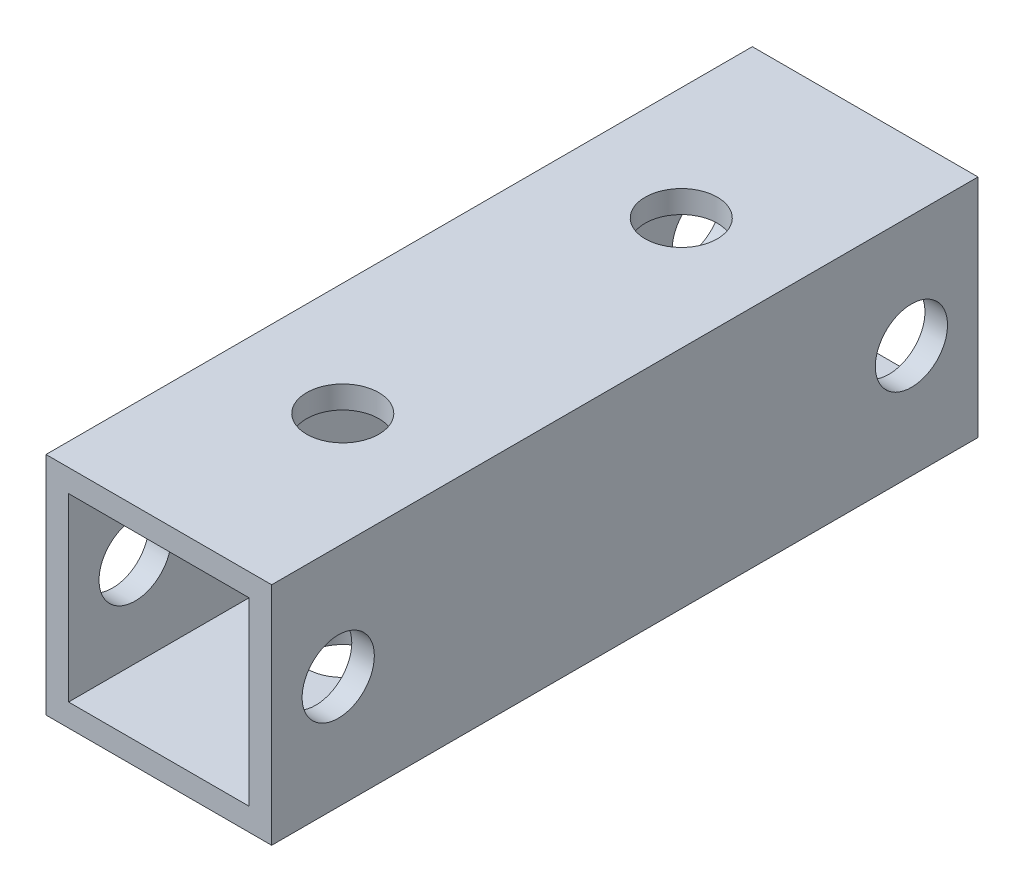
ISO-10303-21;
HEADER;
FILE_DESCRIPTION(('STEP AP214'),'2;1');
FILE_NAME('part.step','',(''),(''),'','','');
FILE_SCHEMA(('AUTOMOTIVE_DESIGN { 1 0 10303 214 1 1 1 1 }'));
ENDSEC;
DATA;
#1=APPLICATION_CONTEXT('core data for automotive mechanical design processes');
#2=APPLICATION_PROTOCOL_DEFINITION('international standard','automotive_design',2000,#1);
#3=PRODUCT_CONTEXT('',#1,'mechanical');
#4=PRODUCT('Part','Part','',(#3));
#5=PRODUCT_RELATED_PRODUCT_CATEGORY('part','',(#4));
#6=PRODUCT_DEFINITION_FORMATION('','',#4);
#7=PRODUCT_DEFINITION_CONTEXT('part definition',#1,'design');
#8=PRODUCT_DEFINITION('design','',#6,#7);
#9=PRODUCT_DEFINITION_SHAPE('','',#8);
#10=(LENGTH_UNIT() NAMED_UNIT(*) SI_UNIT(.MILLI.,.METRE.));
#11=(NAMED_UNIT(*) PLANE_ANGLE_UNIT() SI_UNIT($,.RADIAN.));
#12=(NAMED_UNIT(*) SI_UNIT($,.STERADIAN.) SOLID_ANGLE_UNIT());
#13=UNCERTAINTY_MEASURE_WITH_UNIT(LENGTH_MEASURE(1.E-05),#10,'distance_accuracy_value','');
#14=(GEOMETRIC_REPRESENTATION_CONTEXT(3) GLOBAL_UNCERTAINTY_ASSIGNED_CONTEXT((#13)) GLOBAL_UNIT_ASSIGNED_CONTEXT((#10,
#11,#12)) REPRESENTATION_CONTEXT('',''));
#15=CARTESIAN_POINT('',(0.,0.,0.));
#16=DIRECTION('',(0.,0.,1.));
#17=DIRECTION('',(1.,0.,0.));
#18=AXIS2_PLACEMENT_3D('',#15,#16,#17);
#19=CARTESIAN_POINT('',(0.,0.,31.3));
#20=DIRECTION('',(0.,0.,1.));
#21=DIRECTION('',(1.,0.,0.));
#22=AXIS2_PLACEMENT_3D('',#19,#20,#21);
#23=PLANE('',#22);
#24=DIRECTION('',(0.,-1.,0.));
#25=VECTOR('',#24,1.);
#26=CARTESIAN_POINT('',(0.,0.,31.3));
#27=LINE('',#26,#25);
#28=CARTESIAN_POINT('',(0.,10.,31.3));
#29=VERTEX_POINT('',#28);
#30=CARTESIAN_POINT('',(0.,0.,31.3));
#31=VERTEX_POINT('',#30);
#32=EDGE_CURVE('E162',#29,#31,#27,.T.);
#33=ORIENTED_EDGE('',*,*,#32,.T.);
#34=DIRECTION('',(1.,0.,0.));
#35=VECTOR('',#34,1.);
#36=CARTESIAN_POINT('',(0.,0.,31.3));
#37=LINE('',#36,#35);
#38=CARTESIAN_POINT('',(10.,0.,31.3));
#39=VERTEX_POINT('',#38);
#40=EDGE_CURVE('E165',#31,#39,#37,.T.);
#41=ORIENTED_EDGE('',*,*,#40,.T.);
#42=DIRECTION('',(0.,1.,0.));
#43=VECTOR('',#42,1.);
#44=CARTESIAN_POINT('',(10.,0.,31.3));
#45=LINE('',#44,#43);
#46=CARTESIAN_POINT('',(10.,10.,31.3));
#47=VERTEX_POINT('',#46);
#48=EDGE_CURVE('E168',#39,#47,#45,.T.);
#49=ORIENTED_EDGE('',*,*,#48,.T.);
#50=DIRECTION('',(-1.,0.,0.));
#51=VECTOR('',#50,1.);
#52=CARTESIAN_POINT('',(0.,10.,31.3));
#53=LINE('',#52,#51);
#54=EDGE_CURVE('E170',#47,#29,#53,.T.);
#55=ORIENTED_EDGE('',*,*,#54,.T.);
#56=EDGE_LOOP('',(#33,#41,#49,#55));
#57=FACE_BOUND('',#56,.T.);
#58=DIRECTION('',(1.,0.,0.));
#59=VECTOR('',#58,1.);
#60=CARTESIAN_POINT('',(0.,1.,31.3));
#61=LINE('',#60,#59);
#62=CARTESIAN_POINT('',(1.,1.,31.3));
#63=VERTEX_POINT('',#62);
#64=CARTESIAN_POINT('',(9.,1.,31.3));
#65=VERTEX_POINT('',#64);
#66=EDGE_CURVE('E132',#63,#65,#61,.T.);
#67=ORIENTED_EDGE('',*,*,#66,.F.);
#68=DIRECTION('',(0.,-1.,0.));
#69=VECTOR('',#68,1.);
#70=CARTESIAN_POINT('',(1.,0.,31.3));
#71=LINE('',#70,#69);
#72=CARTESIAN_POINT('',(1.,9.,31.3));
#73=VERTEX_POINT('',#72);
#74=EDGE_CURVE('E124',#73,#63,#71,.T.);
#75=ORIENTED_EDGE('',*,*,#74,.F.);
#76=DIRECTION('',(-1.,0.,0.));
#77=VECTOR('',#76,1.);
#78=CARTESIAN_POINT('',(0.,9.,31.3));
#79=LINE('',#78,#77);
#80=CARTESIAN_POINT('',(9.,9.,31.3));
#81=VERTEX_POINT('',#80);
#82=EDGE_CURVE('E146',#81,#73,#79,.T.);
#83=ORIENTED_EDGE('',*,*,#82,.F.);
#84=DIRECTION('',(0.,1.,0.));
#85=VECTOR('',#84,1.);
#86=CARTESIAN_POINT('',(9.,0.,31.3));
#87=LINE('',#86,#85);
#88=EDGE_CURVE('E144',#65,#81,#87,.T.);
#89=ORIENTED_EDGE('',*,*,#88,.F.);
#90=EDGE_LOOP('',(#67,#75,#83,#89));
#91=FACE_BOUND('',#90,.T.);
#92=ADVANCED_FACE('F57',(#57,#91),#23,.T.);
#93=CARTESIAN_POINT('',(0.,0.,0.));
#94=DIRECTION('',(0.,0.,1.));
#95=DIRECTION('',(1.,0.,0.));
#96=AXIS2_PLACEMENT_3D('',#93,#94,#95);
#97=PLANE('',#96);
#98=DIRECTION('',(0.,-1.,0.));
#99=VECTOR('',#98,1.);
#100=CARTESIAN_POINT('',(0.,0.,0.));
#101=LINE('',#100,#99);
#102=CARTESIAN_POINT('',(0.,10.,0.));
#103=VERTEX_POINT('',#102);
#104=CARTESIAN_POINT('',(0.,0.,0.));
#105=VERTEX_POINT('',#104);
#106=EDGE_CURVE('E140',#103,#105,#101,.T.);
#107=ORIENTED_EDGE('',*,*,#106,.F.);
#108=DIRECTION('',(-1.,0.,0.));
#109=VECTOR('',#108,1.);
#110=CARTESIAN_POINT('',(0.,10.,0.));
#111=LINE('',#110,#109);
#112=CARTESIAN_POINT('',(10.,10.,0.));
#113=VERTEX_POINT('',#112);
#114=EDGE_CURVE('E166',#113,#103,#111,.T.);
#115=ORIENTED_EDGE('',*,*,#114,.F.);
#116=DIRECTION('',(0.,1.,0.));
#117=VECTOR('',#116,1.);
#118=CARTESIAN_POINT('',(10.,0.,0.));
#119=LINE('',#118,#117);
#120=CARTESIAN_POINT('',(10.,0.,0.));
#121=VERTEX_POINT('',#120);
#122=EDGE_CURVE('E177',#121,#113,#119,.T.);
#123=ORIENTED_EDGE('',*,*,#122,.F.);
#124=DIRECTION('',(1.,0.,0.));
#125=VECTOR('',#124,1.);
#126=CARTESIAN_POINT('',(0.,0.,0.));
#127=LINE('',#126,#125);
#128=EDGE_CURVE('E175',#105,#121,#127,.T.);
#129=ORIENTED_EDGE('',*,*,#128,.F.);
#130=EDGE_LOOP('',(#107,#115,#123,#129));
#131=FACE_BOUND('',#130,.T.);
#132=DIRECTION('',(0.,-1.,0.));
#133=VECTOR('',#132,1.);
#134=CARTESIAN_POINT('',(1.,0.,0.));
#135=LINE('',#134,#133);
#136=CARTESIAN_POINT('',(1.,9.,0.));
#137=VERTEX_POINT('',#136);
#138=CARTESIAN_POINT('',(1.,1.,0.));
#139=VERTEX_POINT('',#138);
#140=EDGE_CURVE('E82',#137,#139,#135,.T.);
#141=ORIENTED_EDGE('',*,*,#140,.T.);
#142=DIRECTION('',(1.,0.,0.));
#143=VECTOR('',#142,1.);
#144=CARTESIAN_POINT('',(0.,1.,0.));
#145=LINE('',#144,#143);
#146=CARTESIAN_POINT('',(9.,1.,0.));
#147=VERTEX_POINT('',#146);
#148=EDGE_CURVE('E139',#139,#147,#145,.T.);
#149=ORIENTED_EDGE('',*,*,#148,.T.);
#150=DIRECTION('',(0.,1.,0.));
#151=VECTOR('',#150,1.);
#152=CARTESIAN_POINT('',(9.,0.,0.));
#153=LINE('',#152,#151);
#154=CARTESIAN_POINT('',(9.,9.,0.));
#155=VERTEX_POINT('',#154);
#156=EDGE_CURVE('E154',#147,#155,#153,.T.);
#157=ORIENTED_EDGE('',*,*,#156,.T.);
#158=DIRECTION('',(-1.,0.,0.));
#159=VECTOR('',#158,1.);
#160=CARTESIAN_POINT('',(0.,9.,0.));
#161=LINE('',#160,#159);
#162=EDGE_CURVE('E133',#155,#137,#161,.T.);
#163=ORIENTED_EDGE('',*,*,#162,.T.);
#164=EDGE_LOOP('',(#141,#149,#157,#163));
#165=FACE_BOUND('',#164,.T.);
#166=ADVANCED_FACE('F265',(#131,#165),#97,.F.);
#167=CARTESIAN_POINT('',(0.,0.,31.3));
#168=DIRECTION('',(1.,0.,0.));
#169=DIRECTION('',(0.,0.,-1.));
#170=AXIS2_PLACEMENT_3D('',#167,#168,#169);
#171=PLANE('',#170);
#172=CARTESIAN_POINT('',(0.,5.,28.35));
#173=DIRECTION('',(1.,0.,0.));
#174=DIRECTION('',(0.,0.,-1.));
#175=AXIS2_PLACEMENT_3D('',#172,#173,#174);
#176=CIRCLE('',#175,1.6);
#177=CARTESIAN_POINT('',(0.,5.,26.75));
#178=VERTEX_POINT('',#177);
#179=EDGE_CURVE('E197',#178,#178,#176,.F.);
#180=ORIENTED_EDGE('',*,*,#179,.F.);
#181=EDGE_LOOP('',(#180));
#182=FACE_BOUND('',#181,.T.);
#183=CARTESIAN_POINT('',(0.,5.,2.95));
#184=DIRECTION('',(1.,0.,0.));
#185=DIRECTION('',(0.,0.,-1.));
#186=AXIS2_PLACEMENT_3D('',#183,#184,#185);
#187=CIRCLE('',#186,1.6);
#188=CARTESIAN_POINT('',(0.,5.,1.35));
#189=VERTEX_POINT('',#188);
#190=EDGE_CURVE('E208',#189,#189,#187,.F.);
#191=ORIENTED_EDGE('',*,*,#190,.F.);
#192=EDGE_LOOP('',(#191));
#193=FACE_BOUND('',#192,.T.);
#194=ORIENTED_EDGE('',*,*,#106,.T.);
#195=DIRECTION('',(0.,0.,-1.));
#196=VECTOR('',#195,1.);
#197=CARTESIAN_POINT('',(0.,0.,31.3));
#198=LINE('',#197,#196);
#199=EDGE_CURVE('E12',#31,#105,#198,.T.);
#200=ORIENTED_EDGE('',*,*,#199,.F.);
#201=ORIENTED_EDGE('',*,*,#32,.F.);
#202=DIRECTION('',(0.,0.,-1.));
#203=VECTOR('',#202,1.);
#204=CARTESIAN_POINT('',(0.,10.,31.3));
#205=LINE('',#204,#203);
#206=EDGE_CURVE('E172',#29,#103,#205,.T.);
#207=ORIENTED_EDGE('',*,*,#206,.T.);
#208=EDGE_LOOP('',(#194,#200,#201,#207));
#209=FACE_BOUND('',#208,.T.);
#210=ADVANCED_FACE('F59',(#182,#193,#209),#171,.F.);
#211=CARTESIAN_POINT('',(0.,0.,31.3));
#212=DIRECTION('',(0.,1.,0.));
#213=DIRECTION('',(0.,0.,1.));
#214=AXIS2_PLACEMENT_3D('',#211,#212,#213);
#215=PLANE('',#214);
#216=CARTESIAN_POINT('',(5.,0.,23.15));
#217=DIRECTION('',(0.,1.,0.));
#218=DIRECTION('',(0.,0.,1.));
#219=AXIS2_PLACEMENT_3D('',#216,#217,#218);
#220=CIRCLE('',#219,1.6);
#221=CARTESIAN_POINT('',(5.,0.,24.75));
#222=VERTEX_POINT('',#221);
#223=EDGE_CURVE('E191',#222,#222,#220,.F.);
#224=ORIENTED_EDGE('',*,*,#223,.F.);
#225=EDGE_LOOP('',(#224));
#226=FACE_BOUND('',#225,.T.);
#227=CARTESIAN_POINT('',(5.,0.,8.15));
#228=DIRECTION('',(0.,1.,0.));
#229=DIRECTION('',(0.,0.,1.));
#230=AXIS2_PLACEMENT_3D('',#227,#228,#229);
#231=CIRCLE('',#230,1.6);
#232=CARTESIAN_POINT('',(5.,0.,9.75));
#233=VERTEX_POINT('',#232);
#234=EDGE_CURVE('E223',#233,#233,#231,.F.);
#235=ORIENTED_EDGE('',*,*,#234,.F.);
#236=EDGE_LOOP('',(#235));
#237=FACE_BOUND('',#236,.T.);
#238=ORIENTED_EDGE('',*,*,#128,.T.);
#239=DIRECTION('',(0.,0.,-1.));
#240=VECTOR('',#239,1.);
#241=CARTESIAN_POINT('',(10.,0.,31.3));
#242=LINE('',#241,#240);
#243=EDGE_CURVE('E66',#39,#121,#242,.T.);
#244=ORIENTED_EDGE('',*,*,#243,.F.);
#245=ORIENTED_EDGE('',*,*,#40,.F.);
#246=ORIENTED_EDGE('',*,*,#199,.T.);
#247=EDGE_LOOP('',(#238,#244,#245,#246));
#248=FACE_BOUND('',#247,.T.);
#249=ADVANCED_FACE('F251',(#226,#237,#248),#215,.F.);
#250=CARTESIAN_POINT('',(10.,0.,31.3));
#251=DIRECTION('',(-1.,0.,0.));
#252=DIRECTION('',(0.,0.,1.));
#253=AXIS2_PLACEMENT_3D('',#250,#251,#252);
#254=PLANE('',#253);
#255=CARTESIAN_POINT('',(10.,5.,28.35));
#256=DIRECTION('',(1.,0.,0.));
#257=DIRECTION('',(0.,0.,-1.));
#258=AXIS2_PLACEMENT_3D('',#255,#256,#257);
#259=CIRCLE('',#258,1.6);
#260=CARTESIAN_POINT('',(10.,5.,26.75));
#261=VERTEX_POINT('',#260);
#262=EDGE_CURVE('E203',#261,#261,#259,.T.);
#263=ORIENTED_EDGE('',*,*,#262,.F.);
#264=EDGE_LOOP('',(#263));
#265=FACE_BOUND('',#264,.T.);
#266=CARTESIAN_POINT('',(10.,5.,2.95));
#267=DIRECTION('',(1.,0.,0.));
#268=DIRECTION('',(0.,0.,1.));
#269=AXIS2_PLACEMENT_3D('',#266,#267,#268);
#270=CIRCLE('',#269,1.6);
#271=CARTESIAN_POINT('',(10.,5.,4.55));
#272=VERTEX_POINT('',#271);
#273=EDGE_CURVE('E211',#272,#272,#270,.T.);
#274=ORIENTED_EDGE('',*,*,#273,.F.);
#275=EDGE_LOOP('',(#274));
#276=FACE_BOUND('',#275,.T.);
#277=ORIENTED_EDGE('',*,*,#122,.T.);
#278=DIRECTION('',(0.,0.,-1.));
#279=VECTOR('',#278,1.);
#280=CARTESIAN_POINT('',(10.,10.,31.3));
#281=LINE('',#280,#279);
#282=EDGE_CURVE('E182',#47,#113,#281,.T.);
#283=ORIENTED_EDGE('',*,*,#282,.F.);
#284=ORIENTED_EDGE('',*,*,#48,.F.);
#285=ORIENTED_EDGE('',*,*,#243,.T.);
#286=EDGE_LOOP('',(#277,#283,#284,#285));
#287=FACE_BOUND('',#286,.T.);
#288=ADVANCED_FACE('F254',(#265,#276,#287),#254,.F.);
#289=CARTESIAN_POINT('',(0.,10.,31.3));
#290=DIRECTION('',(0.,-1.,0.));
#291=DIRECTION('',(0.,0.,-1.));
#292=AXIS2_PLACEMENT_3D('',#289,#290,#291);
#293=PLANE('',#292);
#294=CARTESIAN_POINT('',(5.,10.,23.15));
#295=DIRECTION('',(0.,1.,0.));
#296=DIRECTION('',(0.,0.,1.));
#297=AXIS2_PLACEMENT_3D('',#294,#295,#296);
#298=CIRCLE('',#297,1.6);
#299=CARTESIAN_POINT('',(5.,10.,24.75));
#300=VERTEX_POINT('',#299);
#301=EDGE_CURVE('E220',#300,#300,#298,.T.);
#302=ORIENTED_EDGE('',*,*,#301,.F.);
#303=EDGE_LOOP('',(#302));
#304=FACE_BOUND('',#303,.T.);
#305=CARTESIAN_POINT('',(5.,10.,8.15));
#306=DIRECTION('',(0.,1.,0.));
#307=DIRECTION('',(0.,0.,-1.));
#308=AXIS2_PLACEMENT_3D('',#305,#306,#307);
#309=CIRCLE('',#308,1.6);
#310=CARTESIAN_POINT('',(5.,10.,9.75));
#311=VERTEX_POINT('',#310);
#312=EDGE_CURVE('E219',#311,#311,#309,.T.);
#313=ORIENTED_EDGE('',*,*,#312,.F.);
#314=EDGE_LOOP('',(#313));
#315=FACE_BOUND('',#314,.T.);
#316=ORIENTED_EDGE('',*,*,#114,.T.);
#317=ORIENTED_EDGE('',*,*,#206,.F.);
#318=ORIENTED_EDGE('',*,*,#54,.F.);
#319=ORIENTED_EDGE('',*,*,#282,.T.);
#320=EDGE_LOOP('',(#316,#317,#318,#319));
#321=FACE_BOUND('',#320,.T.);
#322=ADVANCED_FACE('F269',(#304,#315,#321),#293,.F.);
#323=CARTESIAN_POINT('',(1.,0.,31.3));
#324=DIRECTION('',(1.,0.,0.));
#325=DIRECTION('',(0.,0.,-1.));
#326=AXIS2_PLACEMENT_3D('',#323,#324,#325);
#327=PLANE('',#326);
#328=CARTESIAN_POINT('',(1.,5.,28.35));
#329=DIRECTION('',(1.,0.,0.));
#330=DIRECTION('',(0.,0.,-1.));
#331=AXIS2_PLACEMENT_3D('',#328,#329,#330);
#332=CIRCLE('',#331,1.6);
#333=CARTESIAN_POINT('',(1.,5.,26.75));
#334=VERTEX_POINT('',#333);
#335=EDGE_CURVE('E216',#334,#334,#332,.T.);
#336=ORIENTED_EDGE('',*,*,#335,.F.);
#337=EDGE_LOOP('',(#336));
#338=FACE_BOUND('',#337,.T.);
#339=CARTESIAN_POINT('',(1.,5.,2.95));
#340=DIRECTION('',(1.,0.,0.));
#341=DIRECTION('',(0.,0.,-1.));
#342=AXIS2_PLACEMENT_3D('',#339,#340,#341);
#343=CIRCLE('',#342,1.6);
#344=CARTESIAN_POINT('',(1.,5.,1.35));
#345=VERTEX_POINT('',#344);
#346=EDGE_CURVE('E196',#345,#345,#343,.T.);
#347=ORIENTED_EDGE('',*,*,#346,.F.);
#348=EDGE_LOOP('',(#347));
#349=FACE_BOUND('',#348,.T.);
#350=ORIENTED_EDGE('',*,*,#140,.F.);
#351=DIRECTION('',(0.,0.,-1.));
#352=VECTOR('',#351,1.);
#353=CARTESIAN_POINT('',(1.,9.,31.3));
#354=LINE('',#353,#352);
#355=EDGE_CURVE('E128',#73,#137,#354,.T.);
#356=ORIENTED_EDGE('',*,*,#355,.F.);
#357=ORIENTED_EDGE('',*,*,#74,.T.);
#358=DIRECTION('',(0.,0.,-1.));
#359=VECTOR('',#358,1.);
#360=CARTESIAN_POINT('',(1.,1.,31.3));
#361=LINE('',#360,#359);
#362=EDGE_CURVE('E127',#63,#139,#361,.T.);
#363=ORIENTED_EDGE('',*,*,#362,.T.);
#364=EDGE_LOOP('',(#350,#356,#357,#363));
#365=FACE_BOUND('',#364,.T.);
#366=ADVANCED_FACE('F126',(#338,#349,#365),#327,.T.);
#367=CARTESIAN_POINT('',(0.,1.,31.3));
#368=DIRECTION('',(0.,1.,0.));
#369=DIRECTION('',(0.,0.,1.));
#370=AXIS2_PLACEMENT_3D('',#367,#368,#369);
#371=PLANE('',#370);
#372=CARTESIAN_POINT('',(5.,1.,23.15));
#373=DIRECTION('',(0.,1.,0.));
#374=DIRECTION('',(0.,0.,1.));
#375=AXIS2_PLACEMENT_3D('',#372,#373,#374);
#376=CIRCLE('',#375,1.6);
#377=CARTESIAN_POINT('',(5.,1.,24.75));
#378=VERTEX_POINT('',#377);
#379=EDGE_CURVE('E152',#378,#378,#376,.T.);
#380=ORIENTED_EDGE('',*,*,#379,.F.);
#381=EDGE_LOOP('',(#380));
#382=FACE_BOUND('',#381,.T.);
#383=CARTESIAN_POINT('',(5.,1.,8.15));
#384=DIRECTION('',(0.,1.,0.));
#385=DIRECTION('',(0.,0.,1.));
#386=AXIS2_PLACEMENT_3D('',#383,#384,#385);
#387=CIRCLE('',#386,1.6);
#388=CARTESIAN_POINT('',(5.,1.,9.75));
#389=VERTEX_POINT('',#388);
#390=EDGE_CURVE('E190',#389,#389,#387,.T.);
#391=ORIENTED_EDGE('',*,*,#390,.F.);
#392=EDGE_LOOP('',(#391));
#393=FACE_BOUND('',#392,.T.);
#394=ORIENTED_EDGE('',*,*,#148,.F.);
#395=ORIENTED_EDGE('',*,*,#362,.F.);
#396=ORIENTED_EDGE('',*,*,#66,.T.);
#397=DIRECTION('',(0.,0.,-1.));
#398=VECTOR('',#397,1.);
#399=CARTESIAN_POINT('',(9.,1.,31.3));
#400=LINE('',#399,#398);
#401=EDGE_CURVE('E141',#65,#147,#400,.T.);
#402=ORIENTED_EDGE('',*,*,#401,.T.);
#403=EDGE_LOOP('',(#394,#395,#396,#402));
#404=FACE_BOUND('',#403,.T.);
#405=ADVANCED_FACE('F136',(#382,#393,#404),#371,.T.);
#406=CARTESIAN_POINT('',(9.,0.,31.3));
#407=DIRECTION('',(-1.,0.,0.));
#408=DIRECTION('',(0.,0.,1.));
#409=AXIS2_PLACEMENT_3D('',#406,#407,#408);
#410=PLANE('',#409);
#411=CARTESIAN_POINT('',(9.,5.,28.35));
#412=DIRECTION('',(-1.,0.,0.));
#413=DIRECTION('',(0.,0.,1.));
#414=AXIS2_PLACEMENT_3D('',#411,#412,#413);
#415=CIRCLE('',#414,1.6);
#416=CARTESIAN_POINT('',(9.,5.,29.95));
#417=VERTEX_POINT('',#416);
#418=EDGE_CURVE('E61',#417,#417,#415,.T.);
#419=ORIENTED_EDGE('',*,*,#418,.F.);
#420=EDGE_LOOP('',(#419));
#421=FACE_BOUND('',#420,.T.);
#422=CARTESIAN_POINT('',(9.,5.,2.95));
#423=DIRECTION('',(-1.,0.,0.));
#424=DIRECTION('',(0.,0.,1.));
#425=AXIS2_PLACEMENT_3D('',#422,#423,#424);
#426=CIRCLE('',#425,1.6);
#427=CARTESIAN_POINT('',(9.,5.,4.55));
#428=VERTEX_POINT('',#427);
#429=EDGE_CURVE('E194',#428,#428,#426,.T.);
#430=ORIENTED_EDGE('',*,*,#429,.F.);
#431=EDGE_LOOP('',(#430));
#432=FACE_BOUND('',#431,.T.);
#433=ORIENTED_EDGE('',*,*,#156,.F.);
#434=ORIENTED_EDGE('',*,*,#401,.F.);
#435=ORIENTED_EDGE('',*,*,#88,.T.);
#436=DIRECTION('',(0.,0.,-1.));
#437=VECTOR('',#436,1.);
#438=CARTESIAN_POINT('',(9.,9.,31.3));
#439=LINE('',#438,#437);
#440=EDGE_CURVE('E74',#81,#155,#439,.T.);
#441=ORIENTED_EDGE('',*,*,#440,.T.);
#442=EDGE_LOOP('',(#433,#434,#435,#441));
#443=FACE_BOUND('',#442,.T.);
#444=ADVANCED_FACE('F239',(#421,#432,#443),#410,.T.);
#445=CARTESIAN_POINT('',(0.,9.,31.3));
#446=DIRECTION('',(0.,-1.,0.));
#447=DIRECTION('',(0.,0.,-1.));
#448=AXIS2_PLACEMENT_3D('',#445,#446,#447);
#449=PLANE('',#448);
#450=CARTESIAN_POINT('',(5.,9.,23.15));
#451=DIRECTION('',(0.,-1.,0.));
#452=DIRECTION('',(0.,0.,-1.));
#453=AXIS2_PLACEMENT_3D('',#450,#451,#452);
#454=CIRCLE('',#453,1.6);
#455=CARTESIAN_POINT('',(5.,9.,24.75));
#456=VERTEX_POINT('',#455);
#457=EDGE_CURVE('E192',#456,#456,#454,.T.);
#458=ORIENTED_EDGE('',*,*,#457,.F.);
#459=EDGE_LOOP('',(#458));
#460=FACE_BOUND('',#459,.T.);
#461=CARTESIAN_POINT('',(5.,9.,8.15));
#462=DIRECTION('',(0.,-1.,0.));
#463=DIRECTION('',(0.,0.,-1.));
#464=AXIS2_PLACEMENT_3D('',#461,#462,#463);
#465=CIRCLE('',#464,1.6);
#466=CARTESIAN_POINT('',(5.,9.,9.75));
#467=VERTEX_POINT('',#466);
#468=EDGE_CURVE('E187',#467,#467,#465,.T.);
#469=ORIENTED_EDGE('',*,*,#468,.F.);
#470=EDGE_LOOP('',(#469));
#471=FACE_BOUND('',#470,.T.);
#472=ORIENTED_EDGE('',*,*,#162,.F.);
#473=ORIENTED_EDGE('',*,*,#440,.F.);
#474=ORIENTED_EDGE('',*,*,#82,.T.);
#475=ORIENTED_EDGE('',*,*,#355,.T.);
#476=EDGE_LOOP('',(#472,#473,#474,#475));
#477=FACE_BOUND('',#476,.T.);
#478=ADVANCED_FACE('F351',(#460,#471,#477),#449,.T.);
#479=CARTESIAN_POINT('',(5.,-4.5254833995939,8.15));
#480=DIRECTION('',(0.,1.,0.));
#481=DIRECTION('',(0.,0.,1.));
#482=AXIS2_PLACEMENT_3D('',#479,#480,#481);
#483=CYLINDRICAL_SURFACE('',#482,1.6);
#484=CARTESIAN_POINT('',(5.,9.,9.75));
#485=CARTESIAN_POINT('',(5.,9.01041666666667,9.75));
#486=CARTESIAN_POINT('',(5.,9.02083333333333,9.75));
#487=CARTESIAN_POINT('',(5.,9.04166666666667,9.75));
#488=CARTESIAN_POINT('',(5.,9.05208333333333,9.75));
#489=CARTESIAN_POINT('',(5.,9.07291666666667,9.75));
#490=CARTESIAN_POINT('',(5.,9.08333333333333,9.75));
#491=CARTESIAN_POINT('',(5.,9.10416666666667,9.75));
#492=CARTESIAN_POINT('',(5.,9.11458333333333,9.75));
#493=CARTESIAN_POINT('',(5.,9.13541666666667,9.75));
#494=CARTESIAN_POINT('',(5.,9.14583333333333,9.75));
#495=CARTESIAN_POINT('',(5.,9.16666666666667,9.75));
#496=CARTESIAN_POINT('',(5.,9.17708333333333,9.75));
#497=CARTESIAN_POINT('',(5.,9.19791666666667,9.75));
#498=CARTESIAN_POINT('',(5.,9.20833333333333,9.75));
#499=CARTESIAN_POINT('',(5.,9.22916666666667,9.75));
#500=CARTESIAN_POINT('',(5.,9.23958333333333,9.75));
#501=CARTESIAN_POINT('',(5.,9.26041666666667,9.75));
#502=CARTESIAN_POINT('',(5.,9.27083333333333,9.75));
#503=CARTESIAN_POINT('',(5.,9.29166666666667,9.75));
#504=CARTESIAN_POINT('',(5.,9.30208333333333,9.75));
#505=CARTESIAN_POINT('',(5.,9.32291666666667,9.75));
#506=CARTESIAN_POINT('',(5.,9.33333333333333,9.75));
#507=CARTESIAN_POINT('',(5.,9.35416666666667,9.75));
#508=CARTESIAN_POINT('',(5.,9.36458333333333,9.75));
#509=CARTESIAN_POINT('',(5.,9.38541666666667,9.75));
#510=CARTESIAN_POINT('',(5.,9.39583333333333,9.75));
#511=CARTESIAN_POINT('',(5.,9.41666666666667,9.75));
#512=CARTESIAN_POINT('',(5.,9.42708333333333,9.75));
#513=CARTESIAN_POINT('',(5.,9.44791666666667,9.75));
#514=CARTESIAN_POINT('',(5.,9.45833333333333,9.75));
#515=CARTESIAN_POINT('',(5.,9.47916666666667,9.75));
#516=CARTESIAN_POINT('',(5.,9.48958333333333,9.75));
#517=CARTESIAN_POINT('',(5.,9.51041666666667,9.75));
#518=CARTESIAN_POINT('',(5.,9.52083333333333,9.75));
#519=CARTESIAN_POINT('',(5.,9.54166666666667,9.75));
#520=CARTESIAN_POINT('',(5.,9.55208333333333,9.75));
#521=CARTESIAN_POINT('',(5.,9.57291666666667,9.75));
#522=CARTESIAN_POINT('',(5.,9.58333333333333,9.75));
#523=CARTESIAN_POINT('',(5.,9.60416666666667,9.75));
#524=CARTESIAN_POINT('',(5.,9.61458333333333,9.75));
#525=CARTESIAN_POINT('',(5.,9.63541666666667,9.75));
#526=CARTESIAN_POINT('',(5.,9.64583333333333,9.75));
#527=CARTESIAN_POINT('',(5.,9.66666666666667,9.75));
#528=CARTESIAN_POINT('',(5.,9.67708333333333,9.75));
#529=CARTESIAN_POINT('',(5.,9.69791666666667,9.75));
#530=CARTESIAN_POINT('',(5.,9.70833333333333,9.75));
#531=CARTESIAN_POINT('',(5.,9.72916666666667,9.75));
#532=CARTESIAN_POINT('',(5.,9.73958333333333,9.75));
#533=CARTESIAN_POINT('',(5.,9.76041666666667,9.75));
#534=CARTESIAN_POINT('',(5.,9.77083333333333,9.75));
#535=CARTESIAN_POINT('',(5.,9.79166666666667,9.75));
#536=CARTESIAN_POINT('',(5.,9.80208333333333,9.75));
#537=CARTESIAN_POINT('',(5.,9.82291666666667,9.75));
#538=CARTESIAN_POINT('',(5.,9.83333333333333,9.75));
#539=CARTESIAN_POINT('',(5.,9.85416666666667,9.75));
#540=CARTESIAN_POINT('',(5.,9.86458333333333,9.75));
#541=CARTESIAN_POINT('',(5.,9.88541666666667,9.75));
#542=CARTESIAN_POINT('',(5.,9.89583333333333,9.75));
#543=CARTESIAN_POINT('',(5.,9.91666666666667,9.75));
#544=CARTESIAN_POINT('',(5.,9.92708333333333,9.75));
#545=CARTESIAN_POINT('',(5.,9.94791666666667,9.75));
#546=CARTESIAN_POINT('',(5.,9.95833333333333,9.75));
#547=CARTESIAN_POINT('',(5.,9.97916666666667,9.75));
#548=CARTESIAN_POINT('',(5.,9.98958333333333,9.75));
#549=CARTESIAN_POINT('',(5.,10.,9.75));
#550=B_SPLINE_CURVE_WITH_KNOTS('',3,(#484,#485,#486,#487,#488,#489,#490,#491,#492,#493,#494,
#495,#496,#497,#498,#499,#500,#501,#502,#503,#504,#505,#506,#507,#508,#509,#510,#511,#512,#513,
#514,#515,#516,#517,#518,#519,#520,#521,#522,#523,#524,#525,#526,#527,#528,#529,#530,#531,#532,
#533,#534,#535,#536,#537,#538,#539,#540,#541,#542,#543,#544,#545,#546,#547,#548,#549),
.UNSPECIFIED.,.F.,.F.,(4,2,2,2,2,2,2,2,2,2,2,2,2,2,2,2,2,2,2,2,2,2,2,2,2,2,2,2,2,2,2,2,4),(0.,
0.03125,0.0625000000000001,0.0937500000000001,0.125,0.15625,0.1875,0.21875,0.25,
0.281249999999999,0.312499999999999,0.343749999999999,0.374999999999999,0.406249999999999,
0.437499999999999,0.468749999999999,0.499999999999999,0.531249999999999,0.562499999999999,
0.593749999999999,0.624999999999999,0.656249999999999,0.687499999999999,0.718749999999999,
0.749999999999997,0.781249999999997,0.812499999999997,0.843749999999997,0.874999999999997,
0.906249999999997,0.937499999999997,0.968749999999997,0.999999999999997),.UNSPECIFIED.);
#551=EDGE_CURVE('BSEAM248',#467,#311,#550,.T.);
#552=ORIENTED_EDGE('',*,*,#468,.T.);
#553=ORIENTED_EDGE('',*,*,#312,.T.);
#554=ORIENTED_EDGE('',*,*,#551,.T.);
#555=ORIENTED_EDGE('',*,*,#551,.F.);
#556=EDGE_LOOP('',(#552,#554,#553,#555));
#557=FACE_BOUND('',#556,.T.);
#558=ADVANCED_FACE('F248',(#557),#483,.F.);
#559=CARTESIAN_POINT('',(5.,-4.5254833995939,23.15));
#560=DIRECTION('',(0.,1.,0.));
#561=DIRECTION('',(0.,0.,1.));
#562=AXIS2_PLACEMENT_3D('',#559,#560,#561);
#563=CYLINDRICAL_SURFACE('',#562,1.6);
#564=CARTESIAN_POINT('',(5.,9.,24.75));
#565=CARTESIAN_POINT('',(5.,9.01041666666667,24.75));
#566=CARTESIAN_POINT('',(5.,9.02083333333333,24.75));
#567=CARTESIAN_POINT('',(5.,9.04166666666667,24.75));
#568=CARTESIAN_POINT('',(5.,9.05208333333333,24.75));
#569=CARTESIAN_POINT('',(5.,9.07291666666667,24.75));
#570=CARTESIAN_POINT('',(5.,9.08333333333333,24.75));
#571=CARTESIAN_POINT('',(5.,9.10416666666667,24.75));
#572=CARTESIAN_POINT('',(5.,9.11458333333333,24.75));
#573=CARTESIAN_POINT('',(5.,9.13541666666667,24.75));
#574=CARTESIAN_POINT('',(5.,9.14583333333333,24.75));
#575=CARTESIAN_POINT('',(5.,9.16666666666667,24.75));
#576=CARTESIAN_POINT('',(5.,9.17708333333333,24.75));
#577=CARTESIAN_POINT('',(5.,9.19791666666667,24.75));
#578=CARTESIAN_POINT('',(5.,9.20833333333333,24.75));
#579=CARTESIAN_POINT('',(5.,9.22916666666667,24.75));
#580=CARTESIAN_POINT('',(5.,9.23958333333333,24.75));
#581=CARTESIAN_POINT('',(5.,9.26041666666667,24.75));
#582=CARTESIAN_POINT('',(5.,9.27083333333333,24.75));
#583=CARTESIAN_POINT('',(5.,9.29166666666667,24.75));
#584=CARTESIAN_POINT('',(5.,9.30208333333333,24.75));
#585=CARTESIAN_POINT('',(5.,9.32291666666667,24.75));
#586=CARTESIAN_POINT('',(5.,9.33333333333333,24.75));
#587=CARTESIAN_POINT('',(5.,9.35416666666667,24.75));
#588=CARTESIAN_POINT('',(5.,9.36458333333333,24.75));
#589=CARTESIAN_POINT('',(5.,9.38541666666667,24.75));
#590=CARTESIAN_POINT('',(5.,9.39583333333333,24.75));
#591=CARTESIAN_POINT('',(5.,9.41666666666667,24.75));
#592=CARTESIAN_POINT('',(5.,9.42708333333333,24.75));
#593=CARTESIAN_POINT('',(5.,9.44791666666667,24.75));
#594=CARTESIAN_POINT('',(5.,9.45833333333333,24.75));
#595=CARTESIAN_POINT('',(5.,9.47916666666667,24.75));
#596=CARTESIAN_POINT('',(5.,9.48958333333333,24.75));
#597=CARTESIAN_POINT('',(5.,9.51041666666667,24.75));
#598=CARTESIAN_POINT('',(5.,9.52083333333333,24.75));
#599=CARTESIAN_POINT('',(5.,9.54166666666667,24.75));
#600=CARTESIAN_POINT('',(5.,9.55208333333333,24.75));
#601=CARTESIAN_POINT('',(5.,9.57291666666667,24.75));
#602=CARTESIAN_POINT('',(5.,9.58333333333333,24.75));
#603=CARTESIAN_POINT('',(5.,9.60416666666667,24.75));
#604=CARTESIAN_POINT('',(5.,9.61458333333333,24.75));
#605=CARTESIAN_POINT('',(5.,9.63541666666667,24.75));
#606=CARTESIAN_POINT('',(5.,9.64583333333333,24.75));
#607=CARTESIAN_POINT('',(5.,9.66666666666667,24.75));
#608=CARTESIAN_POINT('',(5.,9.67708333333333,24.75));
#609=CARTESIAN_POINT('',(5.,9.69791666666667,24.75));
#610=CARTESIAN_POINT('',(5.,9.70833333333333,24.75));
#611=CARTESIAN_POINT('',(5.,9.72916666666667,24.75));
#612=CARTESIAN_POINT('',(5.,9.73958333333333,24.75));
#613=CARTESIAN_POINT('',(5.,9.76041666666667,24.75));
#614=CARTESIAN_POINT('',(5.,9.77083333333333,24.75));
#615=CARTESIAN_POINT('',(5.,9.79166666666667,24.75));
#616=CARTESIAN_POINT('',(5.,9.80208333333333,24.75));
#617=CARTESIAN_POINT('',(5.,9.82291666666667,24.75));
#618=CARTESIAN_POINT('',(5.,9.83333333333333,24.75));
#619=CARTESIAN_POINT('',(5.,9.85416666666667,24.75));
#620=CARTESIAN_POINT('',(5.,9.86458333333333,24.75));
#621=CARTESIAN_POINT('',(5.,9.88541666666667,24.75));
#622=CARTESIAN_POINT('',(5.,9.89583333333333,24.75));
#623=CARTESIAN_POINT('',(5.,9.91666666666667,24.75));
#624=CARTESIAN_POINT('',(5.,9.92708333333333,24.75));
#625=CARTESIAN_POINT('',(5.,9.94791666666667,24.75));
#626=CARTESIAN_POINT('',(5.,9.95833333333333,24.75));
#627=CARTESIAN_POINT('',(5.,9.97916666666667,24.75));
#628=CARTESIAN_POINT('',(5.,9.98958333333333,24.75));
#629=CARTESIAN_POINT('',(5.,10.,24.75));
#630=B_SPLINE_CURVE_WITH_KNOTS('',3,(#564,#565,#566,#567,#568,#569,#570,#571,#572,#573,#574,
#575,#576,#577,#578,#579,#580,#581,#582,#583,#584,#585,#586,#587,#588,#589,#590,#591,#592,#593,
#594,#595,#596,#597,#598,#599,#600,#601,#602,#603,#604,#605,#606,#607,#608,#609,#610,#611,#612,
#613,#614,#615,#616,#617,#618,#619,#620,#621,#622,#623,#624,#625,#626,#627,#628,#629),
.UNSPECIFIED.,.F.,.F.,(4,2,2,2,2,2,2,2,2,2,2,2,2,2,2,2,2,2,2,2,2,2,2,2,2,2,2,2,2,2,2,2,4),(0.,
0.03125,0.0625000000000001,0.0937500000000001,0.125,0.15625,0.1875,0.21875,0.25,
0.281249999999999,0.312499999999999,0.343749999999999,0.374999999999999,0.406249999999999,
0.437499999999999,0.468749999999999,0.499999999999999,0.531249999999999,0.562499999999999,
0.593749999999999,0.624999999999999,0.656249999999999,0.687499999999999,0.718749999999999,
0.749999999999997,0.781249999999997,0.812499999999997,0.843749999999997,0.874999999999997,
0.906249999999997,0.937499999999997,0.968749999999997,0.999999999999997),.UNSPECIFIED.);
#631=EDGE_CURVE('BSEAM246',#456,#300,#630,.T.);
#632=ORIENTED_EDGE('',*,*,#457,.T.);
#633=ORIENTED_EDGE('',*,*,#301,.T.);
#634=ORIENTED_EDGE('',*,*,#631,.T.);
#635=ORIENTED_EDGE('',*,*,#631,.F.);
#636=EDGE_LOOP('',(#632,#634,#633,#635));
#637=FACE_BOUND('',#636,.T.);
#638=ADVANCED_FACE('F246',(#637),#563,.F.);
#639=CARTESIAN_POINT('',(5.,1.,9.75));
#640=CARTESIAN_POINT('',(5.,0.989583333333333,9.75));
#641=CARTESIAN_POINT('',(5.,0.979166666666667,9.75));
#642=CARTESIAN_POINT('',(5.,0.958333333333333,9.75));
#643=CARTESIAN_POINT('',(5.,0.947916666666667,9.75));
#644=CARTESIAN_POINT('',(5.,0.927083333333333,9.75));
#645=CARTESIAN_POINT('',(5.,0.916666666666667,9.75));
#646=CARTESIAN_POINT('',(5.,0.895833333333333,9.75));
#647=CARTESIAN_POINT('',(5.,0.885416666666667,9.75));
#648=CARTESIAN_POINT('',(5.,0.864583333333333,9.75));
#649=CARTESIAN_POINT('',(5.,0.854166666666667,9.75));
#650=CARTESIAN_POINT('',(5.,0.833333333333333,9.75));
#651=CARTESIAN_POINT('',(5.,0.822916666666667,9.75));
#652=CARTESIAN_POINT('',(5.,0.802083333333333,9.75));
#653=CARTESIAN_POINT('',(5.,0.791666666666667,9.75));
#654=CARTESIAN_POINT('',(5.,0.770833333333333,9.75));
#655=CARTESIAN_POINT('',(5.,0.760416666666667,9.75));
#656=CARTESIAN_POINT('',(5.,0.739583333333333,9.75));
#657=CARTESIAN_POINT('',(5.,0.729166666666667,9.75));
#658=CARTESIAN_POINT('',(5.,0.708333333333333,9.75));
#659=CARTESIAN_POINT('',(5.,0.697916666666666,9.75));
#660=CARTESIAN_POINT('',(5.,0.677083333333333,9.75));
#661=CARTESIAN_POINT('',(5.,0.666666666666666,9.75));
#662=CARTESIAN_POINT('',(5.,0.645833333333333,9.75));
#663=CARTESIAN_POINT('',(5.,0.635416666666666,9.75));
#664=CARTESIAN_POINT('',(5.,0.614583333333333,9.75));
#665=CARTESIAN_POINT('',(5.,0.604166666666666,9.75));
#666=CARTESIAN_POINT('',(5.,0.583333333333333,9.75));
#667=CARTESIAN_POINT('',(5.,0.572916666666666,9.75));
#668=CARTESIAN_POINT('',(5.,0.552083333333333,9.75));
#669=CARTESIAN_POINT('',(5.,0.541666666666666,9.75));
#670=CARTESIAN_POINT('',(5.,0.520833333333333,9.75));
#671=CARTESIAN_POINT('',(5.,0.510416666666666,9.75));
#672=CARTESIAN_POINT('',(5.,0.489583333333333,9.75));
#673=CARTESIAN_POINT('',(5.,0.479166666666666,9.75));
#674=CARTESIAN_POINT('',(5.,0.458333333333333,9.75));
#675=CARTESIAN_POINT('',(5.,0.447916666666666,9.75));
#676=CARTESIAN_POINT('',(5.,0.427083333333333,9.75));
#677=CARTESIAN_POINT('',(5.,0.416666666666666,9.75));
#678=CARTESIAN_POINT('',(5.,0.395833333333333,9.75));
#679=CARTESIAN_POINT('',(5.,0.385416666666666,9.75));
#680=CARTESIAN_POINT('',(5.,0.364583333333333,9.75));
#681=CARTESIAN_POINT('',(5.,0.354166666666666,9.75));
#682=CARTESIAN_POINT('',(5.,0.333333333333333,9.75));
#683=CARTESIAN_POINT('',(5.,0.322916666666666,9.75));
#684=CARTESIAN_POINT('',(5.,0.302083333333333,9.75));
#685=CARTESIAN_POINT('',(5.,0.291666666666666,9.75));
#686=CARTESIAN_POINT('',(5.,0.270833333333333,9.75));
#687=CARTESIAN_POINT('',(5.,0.260416666666666,9.75));
#688=CARTESIAN_POINT('',(5.,0.239583333333333,9.75));
#689=CARTESIAN_POINT('',(5.,0.229166666666666,9.75));
#690=CARTESIAN_POINT('',(5.,0.208333333333333,9.75));
#691=CARTESIAN_POINT('',(5.,0.197916666666666,9.75));
#692=CARTESIAN_POINT('',(5.,0.177083333333333,9.75));
#693=CARTESIAN_POINT('',(5.,0.166666666666666,9.75));
#694=CARTESIAN_POINT('',(5.,0.145833333333333,9.75));
#695=CARTESIAN_POINT('',(5.,0.135416666666666,9.75));
#696=CARTESIAN_POINT('',(5.,0.114583333333333,9.75));
#697=CARTESIAN_POINT('',(5.,0.104166666666666,9.75));
#698=CARTESIAN_POINT('',(5.,0.0833333333333325,9.75));
#699=CARTESIAN_POINT('',(5.,0.0729166666666659,9.75));
#700=CARTESIAN_POINT('',(5.,0.0520833333333325,9.75));
#701=CARTESIAN_POINT('',(5.,0.0416666666666658,9.75));
#702=CARTESIAN_POINT('',(5.,0.0208333333333325,9.75));
#703=CARTESIAN_POINT('',(5.,0.0104166666666658,9.75));
#704=CARTESIAN_POINT('',(5.,0.,9.75));
#705=B_SPLINE_CURVE_WITH_KNOTS('',3,(#639,#640,#641,#642,#643,#644,#645,#646,#647,#648,#649,
#650,#651,#652,#653,#654,#655,#656,#657,#658,#659,#660,#661,#662,#663,#664,#665,#666,#667,#668,
#669,#670,#671,#672,#673,#674,#675,#676,#677,#678,#679,#680,#681,#682,#683,#684,#685,#686,#687,
#688,#689,#690,#691,#692,#693,#694,#695,#696,#697,#698,#699,#700,#701,#702,#703,#704),
.UNSPECIFIED.,.F.,.F.,(4,2,2,2,2,2,2,2,2,2,2,2,2,2,2,2,2,2,2,2,2,2,2,2,2,2,2,2,2,2,2,2,4),(0.,
0.03125,0.0625000000000001,0.0937500000000001,0.125,0.15625,0.1875,0.21875,0.25,0.28125,0.3125,
0.34375,0.375,0.40625,0.4375,0.46875,0.5,0.53125,0.5625,0.593750000000001,0.625000000000001,
0.656250000000001,0.687500000000001,0.718750000000001,0.750000000000001,0.781250000000001,
0.812500000000001,0.843750000000001,0.875000000000001,0.906250000000001,0.937500000000001,
0.968750000000001,1.),.UNSPECIFIED.);
#706=EDGE_CURVE('BSEAM243',#389,#233,#705,.T.);
#707=ORIENTED_EDGE('',*,*,#390,.T.);
#708=ORIENTED_EDGE('',*,*,#234,.T.);
#709=ORIENTED_EDGE('',*,*,#706,.T.);
#710=ORIENTED_EDGE('',*,*,#706,.F.);
#711=EDGE_LOOP('',(#707,#709,#708,#710));
#712=FACE_BOUND('',#711,.T.);
#713=ADVANCED_FACE('F243',(#712),#483,.F.);
#714=CARTESIAN_POINT('',(5.,1.,24.75));
#715=CARTESIAN_POINT('',(5.,0.989583333333333,24.75));
#716=CARTESIAN_POINT('',(5.,0.979166666666667,24.75));
#717=CARTESIAN_POINT('',(5.,0.958333333333333,24.75));
#718=CARTESIAN_POINT('',(5.,0.947916666666667,24.75));
#719=CARTESIAN_POINT('',(5.,0.927083333333333,24.75));
#720=CARTESIAN_POINT('',(5.,0.916666666666667,24.75));
#721=CARTESIAN_POINT('',(5.,0.895833333333333,24.75));
#722=CARTESIAN_POINT('',(5.,0.885416666666667,24.75));
#723=CARTESIAN_POINT('',(5.,0.864583333333333,24.75));
#724=CARTESIAN_POINT('',(5.,0.854166666666667,24.75));
#725=CARTESIAN_POINT('',(5.,0.833333333333333,24.75));
#726=CARTESIAN_POINT('',(5.,0.822916666666667,24.75));
#727=CARTESIAN_POINT('',(5.,0.802083333333333,24.75));
#728=CARTESIAN_POINT('',(5.,0.791666666666667,24.75));
#729=CARTESIAN_POINT('',(5.,0.770833333333333,24.75));
#730=CARTESIAN_POINT('',(5.,0.760416666666667,24.75));
#731=CARTESIAN_POINT('',(5.,0.739583333333333,24.75));
#732=CARTESIAN_POINT('',(5.,0.729166666666667,24.75));
#733=CARTESIAN_POINT('',(5.,0.708333333333333,24.75));
#734=CARTESIAN_POINT('',(5.,0.697916666666666,24.75));
#735=CARTESIAN_POINT('',(5.,0.677083333333333,24.75));
#736=CARTESIAN_POINT('',(5.,0.666666666666666,24.75));
#737=CARTESIAN_POINT('',(5.,0.645833333333333,24.75));
#738=CARTESIAN_POINT('',(5.,0.635416666666666,24.75));
#739=CARTESIAN_POINT('',(5.,0.614583333333333,24.75));
#740=CARTESIAN_POINT('',(5.,0.604166666666666,24.75));
#741=CARTESIAN_POINT('',(5.,0.583333333333333,24.75));
#742=CARTESIAN_POINT('',(5.,0.572916666666666,24.75));
#743=CARTESIAN_POINT('',(5.,0.552083333333333,24.75));
#744=CARTESIAN_POINT('',(5.,0.541666666666666,24.75));
#745=CARTESIAN_POINT('',(5.,0.520833333333333,24.75));
#746=CARTESIAN_POINT('',(5.,0.510416666666666,24.75));
#747=CARTESIAN_POINT('',(5.,0.489583333333333,24.75));
#748=CARTESIAN_POINT('',(5.,0.479166666666666,24.75));
#749=CARTESIAN_POINT('',(5.,0.458333333333333,24.75));
#750=CARTESIAN_POINT('',(5.,0.447916666666666,24.75));
#751=CARTESIAN_POINT('',(5.,0.427083333333333,24.75));
#752=CARTESIAN_POINT('',(5.,0.416666666666666,24.75));
#753=CARTESIAN_POINT('',(5.,0.395833333333333,24.75));
#754=CARTESIAN_POINT('',(5.,0.385416666666666,24.75));
#755=CARTESIAN_POINT('',(5.,0.364583333333333,24.75));
#756=CARTESIAN_POINT('',(5.,0.354166666666666,24.75));
#757=CARTESIAN_POINT('',(5.,0.333333333333333,24.75));
#758=CARTESIAN_POINT('',(5.,0.322916666666666,24.75));
#759=CARTESIAN_POINT('',(5.,0.302083333333333,24.75));
#760=CARTESIAN_POINT('',(5.,0.291666666666666,24.75));
#761=CARTESIAN_POINT('',(5.,0.270833333333333,24.75));
#762=CARTESIAN_POINT('',(5.,0.260416666666666,24.75));
#763=CARTESIAN_POINT('',(5.,0.239583333333333,24.75));
#764=CARTESIAN_POINT('',(5.,0.229166666666666,24.75));
#765=CARTESIAN_POINT('',(5.,0.208333333333333,24.75));
#766=CARTESIAN_POINT('',(5.,0.197916666666666,24.75));
#767=CARTESIAN_POINT('',(5.,0.177083333333333,24.75));
#768=CARTESIAN_POINT('',(5.,0.166666666666666,24.75));
#769=CARTESIAN_POINT('',(5.,0.145833333333333,24.75));
#770=CARTESIAN_POINT('',(5.,0.135416666666666,24.75));
#771=CARTESIAN_POINT('',(5.,0.114583333333333,24.75));
#772=CARTESIAN_POINT('',(5.,0.104166666666666,24.75));
#773=CARTESIAN_POINT('',(5.,0.0833333333333325,24.75));
#774=CARTESIAN_POINT('',(5.,0.0729166666666659,24.75));
#775=CARTESIAN_POINT('',(5.,0.0520833333333325,24.75));
#776=CARTESIAN_POINT('',(5.,0.0416666666666658,24.75));
#777=CARTESIAN_POINT('',(5.,0.0208333333333325,24.75));
#778=CARTESIAN_POINT('',(5.,0.0104166666666658,24.75));
#779=CARTESIAN_POINT('',(5.,0.,24.75));
#780=B_SPLINE_CURVE_WITH_KNOTS('',3,(#714,#715,#716,#717,#718,#719,#720,#721,#722,#723,#724,
#725,#726,#727,#728,#729,#730,#731,#732,#733,#734,#735,#736,#737,#738,#739,#740,#741,#742,#743,
#744,#745,#746,#747,#748,#749,#750,#751,#752,#753,#754,#755,#756,#757,#758,#759,#760,#761,#762,
#763,#764,#765,#766,#767,#768,#769,#770,#771,#772,#773,#774,#775,#776,#777,#778,#779),
.UNSPECIFIED.,.F.,.F.,(4,2,2,2,2,2,2,2,2,2,2,2,2,2,2,2,2,2,2,2,2,2,2,2,2,2,2,2,2,2,2,2,4),(0.,
0.03125,0.0625000000000001,0.0937500000000001,0.125,0.15625,0.1875,0.21875,0.25,0.28125,0.3125,
0.34375,0.375,0.40625,0.4375,0.46875,0.5,0.53125,0.5625,0.593750000000001,0.625000000000001,
0.656250000000001,0.687500000000001,0.718750000000001,0.750000000000001,0.781250000000001,
0.812500000000001,0.843750000000001,0.875000000000001,0.906250000000001,0.937500000000001,
0.968750000000001,1.),.UNSPECIFIED.);
#781=EDGE_CURVE('BSEAM234',#378,#222,#780,.T.);
#782=ORIENTED_EDGE('',*,*,#379,.T.);
#783=ORIENTED_EDGE('',*,*,#223,.T.);
#784=ORIENTED_EDGE('',*,*,#781,.T.);
#785=ORIENTED_EDGE('',*,*,#781,.F.);
#786=EDGE_LOOP('',(#782,#784,#783,#785));
#787=FACE_BOUND('',#786,.T.);
#788=ADVANCED_FACE('F234',(#787),#563,.F.);
#789=CARTESIAN_POINT('',(-4.52548339959391,5.,2.95));
#790=DIRECTION('',(1.,0.,0.));
#791=DIRECTION('',(0.,0.,-1.));
#792=AXIS2_PLACEMENT_3D('',#789,#790,#791);
#793=CYLINDRICAL_SURFACE('',#792,1.6);
#794=ORIENTED_EDGE('',*,*,#429,.T.);
#795=EDGE_LOOP('',(#794));
#796=FACE_BOUND('',#795,.T.);
#797=ORIENTED_EDGE('',*,*,#273,.T.);
#798=EDGE_LOOP('',(#797));
#799=FACE_BOUND('',#798,.T.);
#800=ADVANCED_FACE('F293',(#796,#799),#793,.F.);
#801=CARTESIAN_POINT('',(-4.52548339959391,5.,28.35));
#802=DIRECTION('',(1.,0.,0.));
#803=DIRECTION('',(0.,0.,-1.));
#804=AXIS2_PLACEMENT_3D('',#801,#802,#803);
#805=CYLINDRICAL_SURFACE('',#804,1.6);
#806=ORIENTED_EDGE('',*,*,#418,.T.);
#807=EDGE_LOOP('',(#806));
#808=FACE_BOUND('',#807,.T.);
#809=ORIENTED_EDGE('',*,*,#262,.T.);
#810=EDGE_LOOP('',(#809));
#811=FACE_BOUND('',#810,.T.);
#812=ADVANCED_FACE('F295',(#808,#811),#805,.F.);
#813=ORIENTED_EDGE('',*,*,#346,.T.);
#814=EDGE_LOOP('',(#813));
#815=FACE_BOUND('',#814,.T.);
#816=ORIENTED_EDGE('',*,*,#190,.T.);
#817=EDGE_LOOP('',(#816));
#818=FACE_BOUND('',#817,.T.);
#819=ADVANCED_FACE('F297',(#815,#818),#793,.F.);
#820=ORIENTED_EDGE('',*,*,#335,.T.);
#821=EDGE_LOOP('',(#820));
#822=FACE_BOUND('',#821,.T.);
#823=ORIENTED_EDGE('',*,*,#179,.T.);
#824=EDGE_LOOP('',(#823));
#825=FACE_BOUND('',#824,.T.);
#826=ADVANCED_FACE('F304',(#822,#825),#805,.F.);
#827=CLOSED_SHELL('',(#92,#166,#210,#249,#288,#322,#366,#405,#444,#478,#558,#638,#713,#788,#800,
#812,#819,#826));
#828=MANIFOLD_SOLID_BREP('B2',#827);
#829=ADVANCED_BREP_SHAPE_REPRESENTATION('',(#18,#828),#14);
#830=SHAPE_DEFINITION_REPRESENTATION(#9,#829);
ENDSEC;
END-ISO-10303-21;
